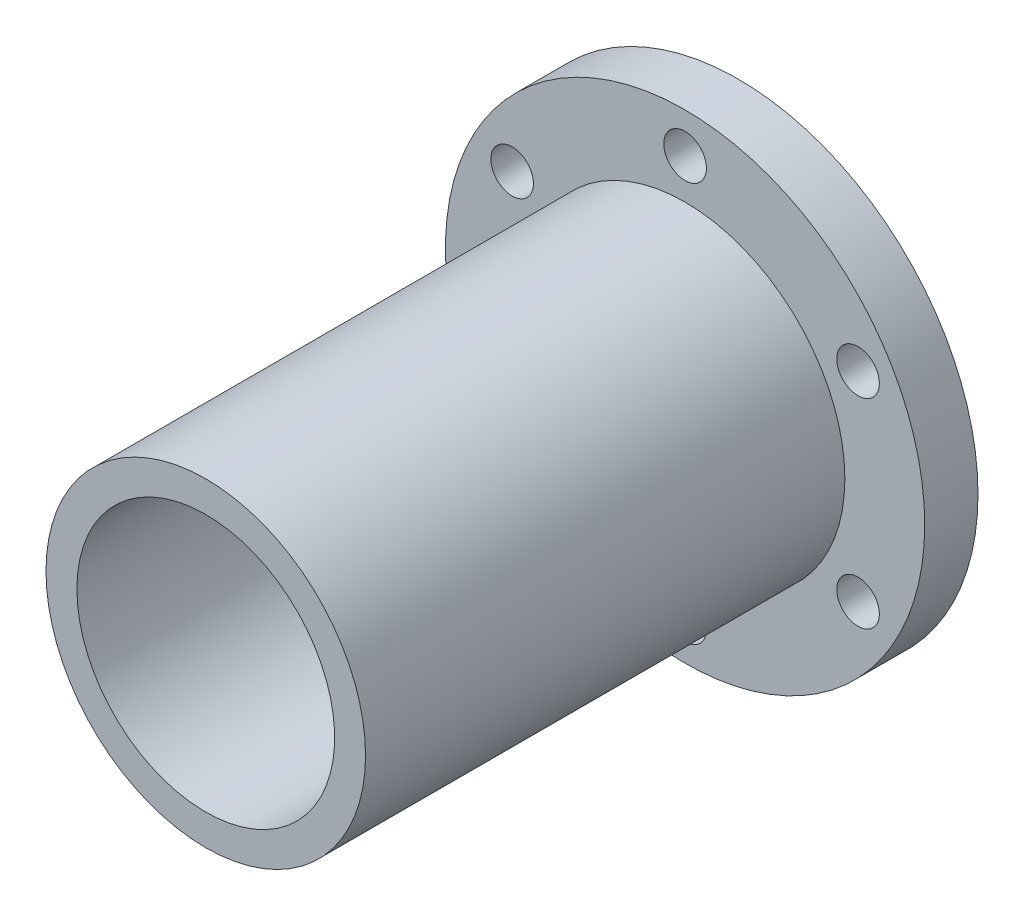
ISO-10303-21;
HEADER;
FILE_DESCRIPTION(('STEP AP214'),'2;1');
FILE_NAME('part.step','',(''),(''),'','','');
FILE_SCHEMA(('AUTOMOTIVE_DESIGN { 1 0 10303 214 1 1 1 1 }'));
ENDSEC;
DATA;
#1=APPLICATION_CONTEXT('core data for automotive mechanical design processes');
#2=APPLICATION_PROTOCOL_DEFINITION('international standard','automotive_design',2000,#1);
#3=PRODUCT_CONTEXT('',#1,'mechanical');
#4=PRODUCT('Part','Part','',(#3));
#5=PRODUCT_RELATED_PRODUCT_CATEGORY('part','',(#4));
#6=PRODUCT_DEFINITION_FORMATION('','',#4);
#7=PRODUCT_DEFINITION_CONTEXT('part definition',#1,'design');
#8=PRODUCT_DEFINITION('design','',#6,#7);
#9=PRODUCT_DEFINITION_SHAPE('','',#8);
#10=(LENGTH_UNIT() NAMED_UNIT(*) SI_UNIT(.MILLI.,.METRE.));
#11=(NAMED_UNIT(*) PLANE_ANGLE_UNIT() SI_UNIT($,.RADIAN.));
#12=(NAMED_UNIT(*) SI_UNIT($,.STERADIAN.) SOLID_ANGLE_UNIT());
#13=UNCERTAINTY_MEASURE_WITH_UNIT(LENGTH_MEASURE(1.E-05),#10,'distance_accuracy_value','');
#14=(GEOMETRIC_REPRESENTATION_CONTEXT(3) GLOBAL_UNCERTAINTY_ASSIGNED_CONTEXT((#13)) GLOBAL_UNIT_ASSIGNED_CONTEXT((#10,
#11,#12)) REPRESENTATION_CONTEXT('',''));
#15=CARTESIAN_POINT('',(0.,0.,0.));
#16=DIRECTION('',(0.,0.,1.));
#17=DIRECTION('',(1.,0.,0.));
#18=AXIS2_PLACEMENT_3D('',#15,#16,#17);
#19=CARTESIAN_POINT('',(0.,0.,5.));
#20=DIRECTION('',(0.,0.,-1.));
#21=DIRECTION('',(-1.,0.,0.));
#22=AXIS2_PLACEMENT_3D('',#19,#20,#21);
#23=CYLINDRICAL_SURFACE('',#22,22.5);
#24=CARTESIAN_POINT('',(0.,0.,5.));
#25=DIRECTION('',(0.,0.,1.));
#26=DIRECTION('',(1.,0.,0.));
#27=AXIS2_PLACEMENT_3D('',#24,#25,#26);
#28=CIRCLE('',#27,22.5);
#29=CARTESIAN_POINT('',(22.5,0.,5.));
#30=VERTEX_POINT('',#29);
#31=EDGE_CURVE('E40',#30,#30,#28,.T.);
#32=ORIENTED_EDGE('',*,*,#31,.F.);
#33=EDGE_LOOP('',(#32));
#34=FACE_BOUND('',#33,.T.);
#35=CARTESIAN_POINT('',(0.,0.,0.));
#36=DIRECTION('',(0.,0.,1.));
#37=DIRECTION('',(1.,0.,0.));
#38=AXIS2_PLACEMENT_3D('',#35,#36,#37);
#39=CIRCLE('',#38,22.5);
#40=CARTESIAN_POINT('',(22.5,0.,0.));
#41=VERTEX_POINT('',#40);
#42=EDGE_CURVE('E44',#41,#41,#39,.T.);
#43=ORIENTED_EDGE('',*,*,#42,.T.);
#44=EDGE_LOOP('',(#43));
#45=FACE_BOUND('',#44,.T.);
#46=ADVANCED_FACE('F34',(#34,#45),#23,.T.);
#47=CARTESIAN_POINT('',(0.,0.,5.));
#48=DIRECTION('',(0.,0.,1.));
#49=DIRECTION('',(1.,0.,0.));
#50=AXIS2_PLACEMENT_3D('',#47,#48,#49);
#51=PLANE('',#50);
#52=CARTESIAN_POINT('',(0.,18.75,5.));
#53=DIRECTION('',(0.,0.,1.));
#54=DIRECTION('',(1.,0.,0.));
#55=AXIS2_PLACEMENT_3D('',#52,#53,#54);
#56=CIRCLE('',#55,2.);
#57=CARTESIAN_POINT('',(2.,18.75,5.));
#58=VERTEX_POINT('',#57);
#59=EDGE_CURVE('E85',#58,#58,#56,.T.);
#60=ORIENTED_EDGE('',*,*,#59,.F.);
#61=EDGE_LOOP('',(#60));
#62=FACE_BOUND('',#61,.T.);
#63=CARTESIAN_POINT('',(-16.2379763209579,9.37499999999942,5.));
#64=DIRECTION('',(0.,0.,1.));
#65=DIRECTION('',(1.,0.,0.));
#66=AXIS2_PLACEMENT_3D('',#63,#64,#65);
#67=CIRCLE('',#66,2.);
#68=CARTESIAN_POINT('',(-14.2379763209579,9.37499999999942,5.));
#69=VERTEX_POINT('',#68);
#70=EDGE_CURVE('E86',#69,#69,#67,.T.);
#71=ORIENTED_EDGE('',*,*,#70,.F.);
#72=EDGE_LOOP('',(#71));
#73=FACE_BOUND('',#72,.T.);
#74=CARTESIAN_POINT('',(-16.2379763209572,-9.37500000000058,5.));
#75=DIRECTION('',(0.,0.,1.));
#76=DIRECTION('',(1.,0.,0.));
#77=AXIS2_PLACEMENT_3D('',#74,#75,#76);
#78=CIRCLE('',#77,2.);
#79=CARTESIAN_POINT('',(-14.2379763209572,-9.37500000000058,5.));
#80=VERTEX_POINT('',#79);
#81=EDGE_CURVE('E60',#80,#80,#78,.T.);
#82=ORIENTED_EDGE('',*,*,#81,.F.);
#83=EDGE_LOOP('',(#82));
#84=FACE_BOUND('',#83,.T.);
#85=CARTESIAN_POINT('',(1.32579492414538E-12,-18.75,5.));
#86=DIRECTION('',(0.,0.,1.));
#87=DIRECTION('',(1.,0.,0.));
#88=AXIS2_PLACEMENT_3D('',#85,#86,#87);
#89=CIRCLE('',#88,2.);
#90=CARTESIAN_POINT('',(2.00000000000133,-18.75,5.));
#91=VERTEX_POINT('',#90);
#92=EDGE_CURVE('E67',#91,#91,#89,.T.);
#93=ORIENTED_EDGE('',*,*,#92,.F.);
#94=EDGE_LOOP('',(#93));
#95=FACE_BOUND('',#94,.T.);
#96=CARTESIAN_POINT('',(16.2379763209592,-9.37499999999942,5.));
#97=DIRECTION('',(0.,0.,1.));
#98=DIRECTION('',(1.,0.,0.));
#99=AXIS2_PLACEMENT_3D('',#96,#97,#98);
#100=CIRCLE('',#99,2.00000000000001);
#101=CARTESIAN_POINT('',(18.2379763209592,-9.37499999999942,5.));
#102=VERTEX_POINT('',#101);
#103=EDGE_CURVE('E73',#102,#102,#100,.T.);
#104=ORIENTED_EDGE('',*,*,#103,.F.);
#105=EDGE_LOOP('',(#104));
#106=FACE_BOUND('',#105,.T.);
#107=CARTESIAN_POINT('',(16.2379763209586,9.37500000000058,5.));
#108=DIRECTION('',(0.,0.,1.));
#109=DIRECTION('',(1.,0.,0.));
#110=AXIS2_PLACEMENT_3D('',#107,#108,#109);
#111=CIRCLE('',#110,2.00000000000001);
#112=CARTESIAN_POINT('',(18.2379763209586,9.37500000000058,5.));
#113=VERTEX_POINT('',#112);
#114=EDGE_CURVE('E79',#113,#113,#111,.T.);
#115=ORIENTED_EDGE('',*,*,#114,.F.);
#116=EDGE_LOOP('',(#115));
#117=FACE_BOUND('',#116,.T.);
#118=CARTESIAN_POINT('',(0.,0.,5.));
#119=DIRECTION('',(0.,0.,1.));
#120=DIRECTION('',(1.,0.,0.));
#121=AXIS2_PLACEMENT_3D('',#118,#119,#120);
#122=CIRCLE('',#121,15.);
#123=CARTESIAN_POINT('',(-15.,0.,5.));
#124=VERTEX_POINT('',#123);
#125=EDGE_CURVE('E51',#124,#124,#122,.T.);
#126=ORIENTED_EDGE('',*,*,#125,.F.);
#127=EDGE_LOOP('',(#126));
#128=FACE_BOUND('',#127,.T.);
#129=ORIENTED_EDGE('',*,*,#31,.T.);
#130=EDGE_LOOP('',(#129));
#131=FACE_BOUND('',#130,.T.);
#132=ADVANCED_FACE('F106',(#62,#73,#84,#95,#106,#117,#128,#131),#51,.T.);
#133=CARTESIAN_POINT('',(0.,0.,0.));
#134=DIRECTION('',(0.,0.,1.));
#135=DIRECTION('',(1.,0.,0.));
#136=AXIS2_PLACEMENT_3D('',#133,#134,#135);
#137=PLANE('',#136);
#138=CARTESIAN_POINT('',(0.,18.75,0.));
#139=DIRECTION('',(0.,0.,1.));
#140=DIRECTION('',(1.,0.,0.));
#141=AXIS2_PLACEMENT_3D('',#138,#139,#140);
#142=CIRCLE('',#141,2.);
#143=CARTESIAN_POINT('',(2.,18.75,0.));
#144=VERTEX_POINT('',#143);
#145=EDGE_CURVE('E59',#144,#144,#142,.T.);
#146=ORIENTED_EDGE('',*,*,#145,.T.);
#147=EDGE_LOOP('',(#146));
#148=FACE_BOUND('',#147,.T.);
#149=CARTESIAN_POINT('',(-16.2379763209579,9.37499999999942,0.));
#150=DIRECTION('',(0.,0.,1.));
#151=DIRECTION('',(1.,0.,0.));
#152=AXIS2_PLACEMENT_3D('',#149,#150,#151);
#153=CIRCLE('',#152,2.);
#154=CARTESIAN_POINT('',(-14.2379763209579,9.37499999999942,0.));
#155=VERTEX_POINT('',#154);
#156=EDGE_CURVE('E64',#155,#155,#153,.T.);
#157=ORIENTED_EDGE('',*,*,#156,.T.);
#158=EDGE_LOOP('',(#157));
#159=FACE_BOUND('',#158,.T.);
#160=CARTESIAN_POINT('',(-16.2379763209572,-9.37500000000058,0.));
#161=DIRECTION('',(0.,0.,1.));
#162=DIRECTION('',(1.,0.,0.));
#163=AXIS2_PLACEMENT_3D('',#160,#161,#162);
#164=CIRCLE('',#163,2.);
#165=CARTESIAN_POINT('',(-14.2379763209572,-9.37500000000058,0.));
#166=VERTEX_POINT('',#165);
#167=EDGE_CURVE('E63',#166,#166,#164,.T.);
#168=ORIENTED_EDGE('',*,*,#167,.T.);
#169=EDGE_LOOP('',(#168));
#170=FACE_BOUND('',#169,.T.);
#171=CARTESIAN_POINT('',(1.32579492414538E-12,-18.75,0.));
#172=DIRECTION('',(0.,0.,1.));
#173=DIRECTION('',(1.,0.,0.));
#174=AXIS2_PLACEMENT_3D('',#171,#172,#173);
#175=CIRCLE('',#174,2.);
#176=CARTESIAN_POINT('',(2.00000000000133,-18.75,0.));
#177=VERTEX_POINT('',#176);
#178=EDGE_CURVE('E70',#177,#177,#175,.T.);
#179=ORIENTED_EDGE('',*,*,#178,.T.);
#180=EDGE_LOOP('',(#179));
#181=FACE_BOUND('',#180,.T.);
#182=CARTESIAN_POINT('',(16.2379763209592,-9.37499999999942,0.));
#183=DIRECTION('',(0.,0.,1.));
#184=DIRECTION('',(1.,0.,0.));
#185=AXIS2_PLACEMENT_3D('',#182,#183,#184);
#186=CIRCLE('',#185,2.00000000000001);
#187=CARTESIAN_POINT('',(18.2379763209592,-9.37499999999942,0.));
#188=VERTEX_POINT('',#187);
#189=EDGE_CURVE('E76',#188,#188,#186,.T.);
#190=ORIENTED_EDGE('',*,*,#189,.T.);
#191=EDGE_LOOP('',(#190));
#192=FACE_BOUND('',#191,.T.);
#193=CARTESIAN_POINT('',(16.2379763209586,9.37500000000058,0.));
#194=DIRECTION('',(0.,0.,1.));
#195=DIRECTION('',(1.,0.,0.));
#196=AXIS2_PLACEMENT_3D('',#193,#194,#195);
#197=CIRCLE('',#196,2.00000000000001);
#198=CARTESIAN_POINT('',(18.2379763209586,9.37500000000058,0.));
#199=VERTEX_POINT('',#198);
#200=EDGE_CURVE('E82',#199,#199,#197,.T.);
#201=ORIENTED_EDGE('',*,*,#200,.T.);
#202=EDGE_LOOP('',(#201));
#203=FACE_BOUND('',#202,.T.);
#204=ORIENTED_EDGE('',*,*,#42,.F.);
#205=EDGE_LOOP('',(#204));
#206=FACE_BOUND('',#205,.T.);
#207=ADVANCED_FACE('F96',(#148,#159,#170,#181,#192,#203,#206),#137,.F.);
#208=CARTESIAN_POINT('',(0.,0.,50.));
#209=DIRECTION('',(0.,0.,1.));
#210=DIRECTION('',(1.,0.,0.));
#211=AXIS2_PLACEMENT_3D('',#208,#209,#210);
#212=PLANE('',#211);
#213=CARTESIAN_POINT('',(0.,0.,50.));
#214=DIRECTION('',(0.,0.,1.));
#215=DIRECTION('',(1.,0.,0.));
#216=AXIS2_PLACEMENT_3D('',#213,#214,#215);
#217=CIRCLE('',#216,15.);
#218=CARTESIAN_POINT('',(-15.,0.,50.));
#219=VERTEX_POINT('',#218);
#220=EDGE_CURVE('E49',#219,#219,#217,.T.);
#221=ORIENTED_EDGE('',*,*,#220,.T.);
#222=EDGE_LOOP('',(#221));
#223=FACE_BOUND('',#222,.T.);
#224=CARTESIAN_POINT('',(0.,0.,50.));
#225=DIRECTION('',(0.,0.,1.));
#226=DIRECTION('',(1.,0.,0.));
#227=AXIS2_PLACEMENT_3D('',#224,#225,#226);
#228=CIRCLE('',#227,12.1);
#229=CARTESIAN_POINT('',(-12.1,0.,50.));
#230=VERTEX_POINT('',#229);
#231=EDGE_CURVE('E54',#230,#230,#228,.T.);
#232=ORIENTED_EDGE('',*,*,#231,.F.);
#233=EDGE_LOOP('',(#232));
#234=FACE_BOUND('',#233,.T.);
#235=ADVANCED_FACE('F126',(#223,#234),#212,.T.);
#236=CARTESIAN_POINT('',(0.,0.,50.));
#237=DIRECTION('',(0.,0.,-1.));
#238=DIRECTION('',(-1.,0.,0.));
#239=AXIS2_PLACEMENT_3D('',#236,#237,#238);
#240=CYLINDRICAL_SURFACE('',#239,15.);
#241=CARTESIAN_POINT('',(-15.,0.,50.));
#242=CARTESIAN_POINT('',(-15.,0.,49.53125));
#243=CARTESIAN_POINT('',(-15.,0.,49.0625));
#244=CARTESIAN_POINT('',(-15.,0.,48.125));
#245=CARTESIAN_POINT('',(-15.,0.,47.65625));
#246=CARTESIAN_POINT('',(-15.,0.,46.71875));
#247=CARTESIAN_POINT('',(-15.,0.,46.25));
#248=CARTESIAN_POINT('',(-15.,0.,45.3125));
#249=CARTESIAN_POINT('',(-15.,0.,44.84375));
#250=CARTESIAN_POINT('',(-15.,0.,43.90625));
#251=CARTESIAN_POINT('',(-15.,0.,43.4375));
#252=CARTESIAN_POINT('',(-15.,0.,42.5));
#253=CARTESIAN_POINT('',(-15.,0.,42.03125));
#254=CARTESIAN_POINT('',(-15.,0.,41.09375));
#255=CARTESIAN_POINT('',(-15.,0.,40.625));
#256=CARTESIAN_POINT('',(-15.,0.,39.6875));
#257=CARTESIAN_POINT('',(-15.,0.,39.21875));
#258=CARTESIAN_POINT('',(-15.,0.,38.28125));
#259=CARTESIAN_POINT('',(-15.,0.,37.8125));
#260=CARTESIAN_POINT('',(-15.,0.,36.875));
#261=CARTESIAN_POINT('',(-15.,0.,36.40625));
#262=CARTESIAN_POINT('',(-15.,0.,35.46875));
#263=CARTESIAN_POINT('',(-15.,0.,35.));
#264=CARTESIAN_POINT('',(-15.,0.,34.0625));
#265=CARTESIAN_POINT('',(-15.,0.,33.59375));
#266=CARTESIAN_POINT('',(-15.,0.,32.65625));
#267=CARTESIAN_POINT('',(-15.,0.,32.1875));
#268=CARTESIAN_POINT('',(-15.,0.,31.25));
#269=CARTESIAN_POINT('',(-15.,0.,30.78125));
#270=CARTESIAN_POINT('',(-15.,0.,29.84375));
#271=CARTESIAN_POINT('',(-15.,0.,29.375));
#272=CARTESIAN_POINT('',(-15.,0.,28.4375));
#273=CARTESIAN_POINT('',(-15.,0.,27.96875));
#274=CARTESIAN_POINT('',(-15.,0.,27.03125));
#275=CARTESIAN_POINT('',(-15.,0.,26.5625));
#276=CARTESIAN_POINT('',(-15.,0.,25.625));
#277=CARTESIAN_POINT('',(-15.,0.,25.15625));
#278=CARTESIAN_POINT('',(-15.,0.,24.21875));
#279=CARTESIAN_POINT('',(-15.,0.,23.75));
#280=CARTESIAN_POINT('',(-15.,0.,22.8125));
#281=CARTESIAN_POINT('',(-15.,0.,22.34375));
#282=CARTESIAN_POINT('',(-15.,0.,21.40625));
#283=CARTESIAN_POINT('',(-15.,0.,20.9375));
#284=CARTESIAN_POINT('',(-15.,0.,20.));
#285=CARTESIAN_POINT('',(-15.,0.,19.53125));
#286=CARTESIAN_POINT('',(-15.,0.,18.59375));
#287=CARTESIAN_POINT('',(-15.,0.,18.125));
#288=CARTESIAN_POINT('',(-15.,0.,17.1875));
#289=CARTESIAN_POINT('',(-15.,0.,16.71875));
#290=CARTESIAN_POINT('',(-15.,0.,15.78125));
#291=CARTESIAN_POINT('',(-15.,0.,15.3125));
#292=CARTESIAN_POINT('',(-15.,0.,14.375));
#293=CARTESIAN_POINT('',(-15.,0.,13.90625));
#294=CARTESIAN_POINT('',(-15.,0.,12.96875));
#295=CARTESIAN_POINT('',(-15.,0.,12.5));
#296=CARTESIAN_POINT('',(-15.,0.,11.5625));
#297=CARTESIAN_POINT('',(-15.,0.,11.09375));
#298=CARTESIAN_POINT('',(-15.,0.,10.15625));
#299=CARTESIAN_POINT('',(-15.,0.,9.6875));
#300=CARTESIAN_POINT('',(-15.,0.,8.75000000000001));
#301=CARTESIAN_POINT('',(-15.,0.,8.28125000000001));
#302=CARTESIAN_POINT('',(-15.,0.,7.34375000000001));
#303=CARTESIAN_POINT('',(-15.,0.,6.875));
#304=CARTESIAN_POINT('',(-15.,0.,5.9375));
#305=CARTESIAN_POINT('',(-15.,0.,5.46875));
#306=CARTESIAN_POINT('',(-15.,0.,5.));
#307=B_SPLINE_CURVE_WITH_KNOTS('',3,(#241,#242,#243,#244,#245,#246,#247,#248,#249,#250,#251,
#252,#253,#254,#255,#256,#257,#258,#259,#260,#261,#262,#263,#264,#265,#266,#267,#268,#269,#270,
#271,#272,#273,#274,#275,#276,#277,#278,#279,#280,#281,#282,#283,#284,#285,#286,#287,#288,#289,
#290,#291,#292,#293,#294,#295,#296,#297,#298,#299,#300,#301,#302,#303,#304,#305,#306),
.UNSPECIFIED.,.F.,.F.,(4,2,2,2,2,2,2,2,2,2,2,2,2,2,2,2,2,2,2,2,2,2,2,2,2,2,2,2,2,2,2,2,4),(0.,
1.40625,2.8125,4.21874999999999,5.62499999999999,7.03125,8.43749999999999,9.84374999999999,
11.25,12.65625,14.0625,15.46875,16.875,18.28125,19.6875,21.09375,22.5,23.90625,25.3125,26.71875,
28.125,29.53125,30.9375,32.34375,33.75,35.15625,36.5625,37.96875,39.375,40.78125,42.1875,
43.59375,45.),.UNSPECIFIED.);
#308=EDGE_CURVE('BSEAM123',#219,#124,#307,.T.);
#309=ORIENTED_EDGE('',*,*,#220,.F.);
#310=ORIENTED_EDGE('',*,*,#125,.T.);
#311=ORIENTED_EDGE('',*,*,#308,.T.);
#312=ORIENTED_EDGE('',*,*,#308,.F.);
#313=EDGE_LOOP('',(#309,#311,#310,#312));
#314=FACE_BOUND('',#313,.T.);
#315=ADVANCED_FACE('F123',(#314),#240,.T.);
#316=CARTESIAN_POINT('',(0.,0.,50.));
#317=DIRECTION('',(0.,0.,-1.));
#318=DIRECTION('',(-1.,0.,0.));
#319=AXIS2_PLACEMENT_3D('',#316,#317,#318);
#320=CYLINDRICAL_SURFACE('',#319,12.1);
#321=CARTESIAN_POINT('',(0.,0.,5.));
#322=DIRECTION('',(0.,0.,1.));
#323=DIRECTION('',(1.,0.,0.));
#324=AXIS2_PLACEMENT_3D('',#321,#322,#323);
#325=CIRCLE('',#324,12.1);
#326=CARTESIAN_POINT('',(-12.1,0.,4.99999999999999));
#327=VERTEX_POINT('',#326);
#328=EDGE_CURVE('E10',#327,#327,#325,.F.);
#329=CARTESIAN_POINT('',(-12.1,0.,50.));
#330=CARTESIAN_POINT('',(-12.1,0.,49.53125));
#331=CARTESIAN_POINT('',(-12.1,0.,49.0625));
#332=CARTESIAN_POINT('',(-12.1,0.,48.125));
#333=CARTESIAN_POINT('',(-12.1,0.,47.65625));
#334=CARTESIAN_POINT('',(-12.1,0.,46.71875));
#335=CARTESIAN_POINT('',(-12.1,0.,46.25));
#336=CARTESIAN_POINT('',(-12.1,0.,45.3125));
#337=CARTESIAN_POINT('',(-12.1,0.,44.84375));
#338=CARTESIAN_POINT('',(-12.1,0.,43.90625));
#339=CARTESIAN_POINT('',(-12.1,0.,43.4375));
#340=CARTESIAN_POINT('',(-12.1,0.,42.5));
#341=CARTESIAN_POINT('',(-12.1,0.,42.03125));
#342=CARTESIAN_POINT('',(-12.1,0.,41.09375));
#343=CARTESIAN_POINT('',(-12.1,0.,40.625));
#344=CARTESIAN_POINT('',(-12.1,0.,39.6875));
#345=CARTESIAN_POINT('',(-12.1,0.,39.21875));
#346=CARTESIAN_POINT('',(-12.1,0.,38.28125));
#347=CARTESIAN_POINT('',(-12.1,0.,37.8125));
#348=CARTESIAN_POINT('',(-12.1,0.,36.875));
#349=CARTESIAN_POINT('',(-12.1,0.,36.40625));
#350=CARTESIAN_POINT('',(-12.1,0.,35.46875));
#351=CARTESIAN_POINT('',(-12.1,0.,35.));
#352=CARTESIAN_POINT('',(-12.1,0.,34.0625));
#353=CARTESIAN_POINT('',(-12.1,0.,33.59375));
#354=CARTESIAN_POINT('',(-12.1,0.,32.65625));
#355=CARTESIAN_POINT('',(-12.1,0.,32.1875));
#356=CARTESIAN_POINT('',(-12.1,0.,31.25));
#357=CARTESIAN_POINT('',(-12.1,0.,30.78125));
#358=CARTESIAN_POINT('',(-12.1,0.,29.84375));
#359=CARTESIAN_POINT('',(-12.1,0.,29.375));
#360=CARTESIAN_POINT('',(-12.1,0.,28.4375));
#361=CARTESIAN_POINT('',(-12.1,0.,27.96875));
#362=CARTESIAN_POINT('',(-12.1,0.,27.03125));
#363=CARTESIAN_POINT('',(-12.1,0.,26.5625));
#364=CARTESIAN_POINT('',(-12.1,0.,25.625));
#365=CARTESIAN_POINT('',(-12.1,0.,25.15625));
#366=CARTESIAN_POINT('',(-12.1,0.,24.21875));
#367=CARTESIAN_POINT('',(-12.1,0.,23.75));
#368=CARTESIAN_POINT('',(-12.1,0.,22.8125));
#369=CARTESIAN_POINT('',(-12.1,0.,22.34375));
#370=CARTESIAN_POINT('',(-12.1,0.,21.40625));
#371=CARTESIAN_POINT('',(-12.1,0.,20.9375));
#372=CARTESIAN_POINT('',(-12.1,0.,20.));
#373=CARTESIAN_POINT('',(-12.1,0.,19.53125));
#374=CARTESIAN_POINT('',(-12.1,0.,18.59375));
#375=CARTESIAN_POINT('',(-12.1,0.,18.125));
#376=CARTESIAN_POINT('',(-12.1,0.,17.1875));
#377=CARTESIAN_POINT('',(-12.1,0.,16.71875));
#378=CARTESIAN_POINT('',(-12.1,0.,15.78125));
#379=CARTESIAN_POINT('',(-12.1,0.,15.3125));
#380=CARTESIAN_POINT('',(-12.1,0.,14.375));
#381=CARTESIAN_POINT('',(-12.1,0.,13.90625));
#382=CARTESIAN_POINT('',(-12.1,0.,12.96875));
#383=CARTESIAN_POINT('',(-12.1,0.,12.5));
#384=CARTESIAN_POINT('',(-12.1,0.,11.5625));
#385=CARTESIAN_POINT('',(-12.1,0.,11.09375));
#386=CARTESIAN_POINT('',(-12.1,0.,10.15625));
#387=CARTESIAN_POINT('',(-12.1,0.,9.68749999999999));
#388=CARTESIAN_POINT('',(-12.1,0.,8.74999999999999));
#389=CARTESIAN_POINT('',(-12.1,0.,8.28124999999999));
#390=CARTESIAN_POINT('',(-12.1,0.,7.34374999999999));
#391=CARTESIAN_POINT('',(-12.1,0.,6.87499999999999));
#392=CARTESIAN_POINT('',(-12.1,0.,5.93749999999999));
#393=CARTESIAN_POINT('',(-12.1,0.,5.46874999999999));
#394=CARTESIAN_POINT('',(-12.1,0.,4.99999999999999));
#395=B_SPLINE_CURVE_WITH_KNOTS('',3,(#329,#330,#331,#332,#333,#334,#335,#336,#337,#338,#339,
#340,#341,#342,#343,#344,#345,#346,#347,#348,#349,#350,#351,#352,#353,#354,#355,#356,#357,#358,
#359,#360,#361,#362,#363,#364,#365,#366,#367,#368,#369,#370,#371,#372,#373,#374,#375,#376,#377,
#378,#379,#380,#381,#382,#383,#384,#385,#386,#387,#388,#389,#390,#391,#392,#393,#394),
.UNSPECIFIED.,.F.,.F.,(4,2,2,2,2,2,2,2,2,2,2,2,2,2,2,2,2,2,2,2,2,2,2,2,2,2,2,2,2,2,2,2,4),(0.,
1.40625,2.8125,4.21875,5.62500000000001,7.03125,8.43750000000001,9.84375000000001,11.25,
12.65625,14.0625,15.46875,16.875,18.28125,19.6875,21.09375,22.5,23.90625,25.3125,26.71875,
28.125,29.53125,30.9375,32.34375,33.75,35.15625,36.5625,37.96875,39.375,40.78125,42.1875,
43.59375,45.),.UNSPECIFIED.);
#396=EDGE_CURVE('BSEAM125',#230,#327,#395,.T.);
#397=ORIENTED_EDGE('',*,*,#231,.T.);
#398=ORIENTED_EDGE('',*,*,#328,.T.);
#399=ORIENTED_EDGE('',*,*,#396,.T.);
#400=ORIENTED_EDGE('',*,*,#396,.F.);
#401=EDGE_LOOP('',(#397,#399,#398,#400));
#402=FACE_BOUND('',#401,.T.);
#403=ADVANCED_FACE('F125',(#402),#320,.F.);
#404=ORIENTED_EDGE('',*,*,#328,.F.);
#405=EDGE_LOOP('',(#404));
#406=FACE_BOUND('',#405,.T.);
#407=ADVANCED_FACE('F110',(#406),#51,.T.);
#408=CARTESIAN_POINT('',(16.2379763209586,9.37500000000058,0.));
#409=DIRECTION('',(0.,0.,1.));
#410=DIRECTION('',(1.,0.,0.));
#411=AXIS2_PLACEMENT_3D('',#408,#409,#410);
#412=CYLINDRICAL_SURFACE('',#411,2.00000000000001);
#413=ORIENTED_EDGE('',*,*,#200,.F.);
#414=EDGE_LOOP('',(#413));
#415=FACE_BOUND('',#414,.T.);
#416=ORIENTED_EDGE('',*,*,#114,.T.);
#417=EDGE_LOOP('',(#416));
#418=FACE_BOUND('',#417,.T.);
#419=ADVANCED_FACE('F176',(#415,#418),#412,.F.);
#420=CARTESIAN_POINT('',(16.2379763209592,-9.37499999999942,0.));
#421=DIRECTION('',(0.,0.,1.));
#422=DIRECTION('',(1.,0.,0.));
#423=AXIS2_PLACEMENT_3D('',#420,#421,#422);
#424=CYLINDRICAL_SURFACE('',#423,2.00000000000001);
#425=ORIENTED_EDGE('',*,*,#189,.F.);
#426=EDGE_LOOP('',(#425));
#427=FACE_BOUND('',#426,.T.);
#428=ORIENTED_EDGE('',*,*,#103,.T.);
#429=EDGE_LOOP('',(#428));
#430=FACE_BOUND('',#429,.T.);
#431=ADVANCED_FACE('F192',(#427,#430),#424,.F.);
#432=CARTESIAN_POINT('',(1.32579492414538E-12,-18.75,0.));
#433=DIRECTION('',(0.,0.,1.));
#434=DIRECTION('',(1.,0.,0.));
#435=AXIS2_PLACEMENT_3D('',#432,#433,#434);
#436=CYLINDRICAL_SURFACE('',#435,2.);
#437=ORIENTED_EDGE('',*,*,#178,.F.);
#438=EDGE_LOOP('',(#437));
#439=FACE_BOUND('',#438,.T.);
#440=ORIENTED_EDGE('',*,*,#92,.T.);
#441=EDGE_LOOP('',(#440));
#442=FACE_BOUND('',#441,.T.);
#443=ADVANCED_FACE('F199',(#439,#442),#436,.F.);
#444=CARTESIAN_POINT('',(-16.2379763209572,-9.37500000000058,0.));
#445=DIRECTION('',(0.,0.,1.));
#446=DIRECTION('',(1.,0.,0.));
#447=AXIS2_PLACEMENT_3D('',#444,#445,#446);
#448=CYLINDRICAL_SURFACE('',#447,2.);
#449=ORIENTED_EDGE('',*,*,#167,.F.);
#450=EDGE_LOOP('',(#449));
#451=FACE_BOUND('',#450,.T.);
#452=ORIENTED_EDGE('',*,*,#81,.T.);
#453=EDGE_LOOP('',(#452));
#454=FACE_BOUND('',#453,.T.);
#455=ADVANCED_FACE('F207',(#451,#454),#448,.F.);
#456=CARTESIAN_POINT('',(-16.2379763209579,9.37499999999942,0.));
#457=DIRECTION('',(0.,0.,1.));
#458=DIRECTION('',(1.,0.,0.));
#459=AXIS2_PLACEMENT_3D('',#456,#457,#458);
#460=CYLINDRICAL_SURFACE('',#459,2.);
#461=ORIENTED_EDGE('',*,*,#156,.F.);
#462=EDGE_LOOP('',(#461));
#463=FACE_BOUND('',#462,.T.);
#464=ORIENTED_EDGE('',*,*,#70,.T.);
#465=EDGE_LOOP('',(#464));
#466=FACE_BOUND('',#465,.T.);
#467=ADVANCED_FACE('F102',(#463,#466),#460,.F.);
#468=CARTESIAN_POINT('',(0.,18.75,0.));
#469=DIRECTION('',(0.,0.,1.));
#470=DIRECTION('',(1.,0.,0.));
#471=AXIS2_PLACEMENT_3D('',#468,#469,#470);
#472=CYLINDRICAL_SURFACE('',#471,2.);
#473=ORIENTED_EDGE('',*,*,#145,.F.);
#474=EDGE_LOOP('',(#473));
#475=FACE_BOUND('',#474,.T.);
#476=ORIENTED_EDGE('',*,*,#59,.T.);
#477=EDGE_LOOP('',(#476));
#478=FACE_BOUND('',#477,.T.);
#479=ADVANCED_FACE('F99',(#475,#478),#472,.F.);
#480=CLOSED_SHELL('',(#46,#132,#207,#235,#315,#403,#407,#419,#431,#443,#455,#467,#479));
#481=MANIFOLD_SOLID_BREP('B2',#480);
#482=ADVANCED_BREP_SHAPE_REPRESENTATION('',(#18,#481),#14);
#483=SHAPE_DEFINITION_REPRESENTATION(#9,#482);
ENDSEC;
END-ISO-10303-21;
